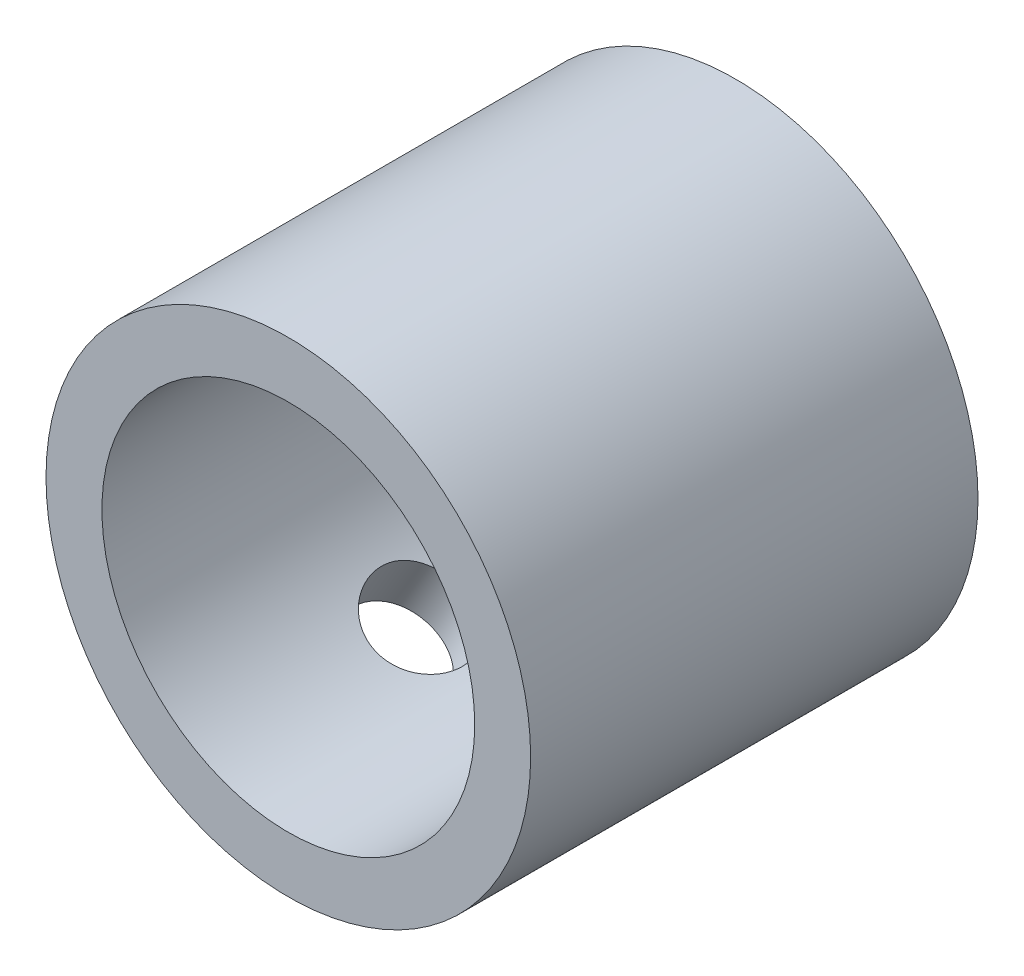
ISO-10303-21;
HEADER;
FILE_DESCRIPTION(('STEP AP214'),'2;1');
FILE_NAME('part.step','',(''),(''),'','','');
FILE_SCHEMA(('AUTOMOTIVE_DESIGN { 1 0 10303 214 1 1 1 1 }'));
ENDSEC;
DATA;
#1=APPLICATION_CONTEXT('core data for automotive mechanical design processes');
#2=APPLICATION_PROTOCOL_DEFINITION('international standard','automotive_design',2000,#1);
#3=PRODUCT_CONTEXT('',#1,'mechanical');
#4=PRODUCT('Part','Part','',(#3));
#5=PRODUCT_RELATED_PRODUCT_CATEGORY('part','',(#4));
#6=PRODUCT_DEFINITION_FORMATION('','',#4);
#7=PRODUCT_DEFINITION_CONTEXT('part definition',#1,'design');
#8=PRODUCT_DEFINITION('design','',#6,#7);
#9=PRODUCT_DEFINITION_SHAPE('','',#8);
#10=(LENGTH_UNIT() NAMED_UNIT(*) SI_UNIT(.MILLI.,.METRE.));
#11=(NAMED_UNIT(*) PLANE_ANGLE_UNIT() SI_UNIT($,.RADIAN.));
#12=(NAMED_UNIT(*) SI_UNIT($,.STERADIAN.) SOLID_ANGLE_UNIT());
#13=UNCERTAINTY_MEASURE_WITH_UNIT(LENGTH_MEASURE(1.E-05),#10,'distance_accuracy_value','');
#14=(GEOMETRIC_REPRESENTATION_CONTEXT(3) GLOBAL_UNCERTAINTY_ASSIGNED_CONTEXT((#13)) GLOBAL_UNIT_ASSIGNED_CONTEXT((#10,
#11,#12)) REPRESENTATION_CONTEXT('',''));
#15=CARTESIAN_POINT('',(0.,0.,0.));
#16=DIRECTION('',(0.,0.,1.));
#17=DIRECTION('',(1.,0.,0.));
#18=AXIS2_PLACEMENT_3D('',#15,#16,#17);
#19=CARTESIAN_POINT('',(0.,0.,12.));
#20=DIRECTION('',(0.,0.,1.));
#21=DIRECTION('',(1.,0.,0.));
#22=AXIS2_PLACEMENT_3D('',#19,#20,#21);
#23=PLANE('',#22);
#24=CARTESIAN_POINT('',(0.,0.,12.));
#25=DIRECTION('',(0.,0.,1.));
#26=DIRECTION('',(1.,0.,0.));
#27=AXIS2_PLACEMENT_3D('',#24,#25,#26);
#28=CIRCLE('',#27,6.5);
#29=CARTESIAN_POINT('',(6.5,0.,12.));
#30=VERTEX_POINT('',#29);
#31=EDGE_CURVE('E12',#30,#30,#28,.T.);
#32=ORIENTED_EDGE('',*,*,#31,.T.);
#33=EDGE_LOOP('',(#32));
#34=FACE_BOUND('',#33,.T.);
#35=CARTESIAN_POINT('',(0.,0.,12.));
#36=DIRECTION('',(0.,0.,1.));
#37=DIRECTION('',(1.,0.,0.));
#38=AXIS2_PLACEMENT_3D('',#35,#36,#37);
#39=CIRCLE('',#38,5.);
#40=CARTESIAN_POINT('',(5.,0.,12.));
#41=VERTEX_POINT('',#40);
#42=EDGE_CURVE('E63',#41,#41,#39,.T.);
#43=ORIENTED_EDGE('',*,*,#42,.F.);
#44=EDGE_LOOP('',(#43));
#45=FACE_BOUND('',#44,.T.);
#46=ADVANCED_FACE('F44',(#34,#45),#23,.T.);
#47=CARTESIAN_POINT('',(0.,0.,0.));
#48=DIRECTION('',(0.,0.,1.));
#49=DIRECTION('',(1.,0.,0.));
#50=AXIS2_PLACEMENT_3D('',#47,#48,#49);
#51=PLANE('',#50);
#52=CARTESIAN_POINT('',(0.,0.,0.));
#53=DIRECTION('',(0.,0.,1.));
#54=DIRECTION('',(1.,0.,0.));
#55=AXIS2_PLACEMENT_3D('',#52,#53,#54);
#56=CIRCLE('',#55,6.5);
#57=CARTESIAN_POINT('',(6.5,0.,0.));
#58=VERTEX_POINT('',#57);
#59=EDGE_CURVE('E58',#58,#58,#56,.T.);
#60=ORIENTED_EDGE('',*,*,#59,.F.);
#61=EDGE_LOOP('',(#60));
#62=FACE_BOUND('',#61,.T.);
#63=CARTESIAN_POINT('',(0.,0.,0.));
#64=DIRECTION('',(0.,0.,1.));
#65=DIRECTION('',(1.,0.,0.));
#66=AXIS2_PLACEMENT_3D('',#63,#64,#65);
#67=CIRCLE('',#66,5.);
#68=CARTESIAN_POINT('',(5.,0.,0.));
#69=VERTEX_POINT('',#68);
#70=EDGE_CURVE('E65',#69,#69,#67,.T.);
#71=ORIENTED_EDGE('',*,*,#70,.T.);
#72=EDGE_LOOP('',(#71));
#73=FACE_BOUND('',#72,.T.);
#74=ADVANCED_FACE('F86',(#62,#73),#51,.F.);
#75=CARTESIAN_POINT('',(0.,0.,12.));
#76=DIRECTION('',(0.,0.,-1.));
#77=DIRECTION('',(-1.,0.,0.));
#78=AXIS2_PLACEMENT_3D('',#75,#76,#77);
#79=CYLINDRICAL_SURFACE('',#78,6.5);
#80=CARTESIAN_POINT('',(-2.10680595081272,-6.14909494849609,6.));
#81=CARTESIAN_POINT('',(-2.10680891015902,-6.14909481194707,5.93048707012988));
#82=CARTESIAN_POINT('',(-2.11241892745597,-6.14718063383391,5.86094038493951));
#83=CARTESIAN_POINT('',(-2.13464610579889,-6.13949664863014,5.72381047058596));
#84=CARTESIAN_POINT('',(-2.1512724040642,-6.13372364088048,5.65622891997642));
#85=CARTESIAN_POINT('',(-2.19485925341188,-6.11826148900385,5.52503317761874));
#86=CARTESIAN_POINT('',(-2.22180993201846,-6.10857608554421,5.46141526308505));
#87=CARTESIAN_POINT('',(-2.28504088258076,-6.08520494153356,5.33981372503317));
#88=CARTESIAN_POINT('',(-2.32132050504985,-6.07151947945995,5.28182970966664));
#89=CARTESIAN_POINT('',(-2.40242260829211,-6.03989047703804,5.17237939378113));
#90=CARTESIAN_POINT('',(-2.44734030595061,-6.02189887195448,5.12099752524567));
#91=CARTESIAN_POINT('',(-2.5439279708677,-5.98173561891913,5.0269462349264));
#92=CARTESIAN_POINT('',(-2.59559839219956,-5.95956368982547,4.98427739952779));
#93=CARTESIAN_POINT('',(-2.70445910262546,-5.91096244381565,4.90853829487111));
#94=CARTESIAN_POINT('',(-2.76169039235706,-5.88450036320741,4.87554787064747));
#95=CARTESIAN_POINT('',(-2.87947386880325,-5.82776951844491,4.82061678733642));
#96=CARTESIAN_POINT('',(-2.94002576775632,-5.79750108385343,4.79867517244008));
#97=CARTESIAN_POINT('',(-3.06178111774662,-5.73412130276562,4.76672629824719));
#98=CARTESIAN_POINT('',(-3.1229675898993,-5.70104917422161,4.75657661243997));
#99=CARTESIAN_POINT('',(-3.24484859964826,-5.63256970840047,4.74805570838893));
#100=CARTESIAN_POINT('',(-3.30554318073036,-5.5971625801353,4.749683437332));
#101=CARTESIAN_POINT('',(-3.4238942369635,-5.5255471978732,4.76456238130295));
#102=CARTESIAN_POINT('',(-3.48158019855085,-5.48935563842616,4.77766021656545));
#103=CARTESIAN_POINT('',(-3.5932467434158,-5.41691887407388,4.81486472715625));
#104=CARTESIAN_POINT('',(-3.64722718646145,-5.38067366719137,4.83897181885584));
#105=CARTESIAN_POINT('',(-3.75049370546047,-5.30921528408094,4.89765514107205));
#106=CARTESIAN_POINT('',(-3.79975024625686,-5.27400944739583,4.93229222264249));
#107=CARTESIAN_POINT('',(-3.8921354899625,-5.20620495037745,5.01100739696977));
#108=CARTESIAN_POINT('',(-3.93526353783645,-5.17360656890086,5.05508649766285));
#109=CARTESIAN_POINT('',(-4.01516583574229,-5.11185275887995,5.15227825458429));
#110=CARTESIAN_POINT('',(-4.05182641531518,-5.08276132491211,5.2055251171175));
#111=CARTESIAN_POINT('',(-4.11720290964005,-5.02995146103541,5.31909508733619));
#112=CARTESIAN_POINT('',(-4.14591869586581,-5.00623311805041,5.37941830947643));
#113=CARTESIAN_POINT('',(-4.19488630910864,-4.96527488683251,5.50560700863562));
#114=CARTESIAN_POINT('',(-4.21512230669786,-4.94804712071205,5.57148257756181));
#115=CARTESIAN_POINT('',(-4.24663596941345,-4.92102815953233,5.70680377718947));
#116=CARTESIAN_POINT('',(-4.25791470671825,-4.91123607443285,5.77624897954819));
#117=CARTESIAN_POINT('',(-4.27117111968917,-4.89971163491314,5.91555966231427));
#118=CARTESIAN_POINT('',(-4.27329330958192,-4.89785405798343,5.9854010568419));
#119=CARTESIAN_POINT('',(-4.26858766204806,-4.90195560759049,6.12454768193484));
#120=CARTESIAN_POINT('',(-4.26176029158196,-4.90791432629701,6.1938529402843));
#121=CARTESIAN_POINT('',(-4.23939864468693,-4.92724184014794,6.32933747159623));
#122=CARTESIAN_POINT('',(-4.22394112871789,-4.94054529637308,6.39553880208332));
#123=CARTESIAN_POINT('',(-4.18468162103085,-4.97384139458384,6.52364442372726));
#124=CARTESIAN_POINT('',(-4.16087898668303,-4.99383455171569,6.58554838351792));
#125=CARTESIAN_POINT('',(-4.10504584434213,-5.03983311068238,6.7041271211925));
#126=CARTESIAN_POINT('',(-4.07291920101646,-5.06590837900064,6.76072950721886));
#127=CARTESIAN_POINT('',(-4.00119537075471,-5.12274579527424,6.86634255943298));
#128=CARTESIAN_POINT('',(-3.96159747556264,-5.15350838752292,6.91535250507359));
#129=CARTESIAN_POINT('',(-3.87509751578268,-5.2188689690894,7.00509487601673));
#130=CARTESIAN_POINT('',(-3.82810028452954,-5.25351494573741,7.04570076602868));
#131=CARTESIAN_POINT('',(-3.72823360544658,-5.32485062485311,7.11658765304746));
#132=CARTESIAN_POINT('',(-3.6753643918481,-5.36154024577144,7.14686906169832));
#133=CARTESIAN_POINT('',(-3.56531377942996,-5.43533799719761,7.19605986491778));
#134=CARTESIAN_POINT('',(-3.50815748238342,-5.47244275202841,7.21503040532308));
#135=CARTESIAN_POINT('',(-3.39078048452915,-5.54593530147536,7.2412555973101));
#136=CARTESIAN_POINT('',(-3.33056012446323,-5.58232317519131,7.24851154869841));
#137=CARTESIAN_POINT('',(-3.20975208152319,-5.65263643701629,7.25105441574626));
#138=CARTESIAN_POINT('',(-3.1491859142281,-5.68659203454368,7.24653211116508));
#139=CARTESIAN_POINT('',(-3.02851510166027,-5.75176493481433,7.22606595991717));
#140=CARTESIAN_POINT('',(-2.96841045146539,-5.78298226679866,7.21012223523286));
#141=CARTESIAN_POINT('',(-2.85058893998532,-5.84195842480286,7.16734790380587));
#142=CARTESIAN_POINT('',(-2.79286764934579,-5.86972387886127,7.14053859582399));
#143=CARTESIAN_POINT('',(-2.68144099807801,-5.92145692862773,7.07681744274669));
#144=CARTESIAN_POINT('',(-2.62773592537912,-5.94542425217906,7.03990487421402));
#145=CARTESIAN_POINT('',(-2.52523693013143,-5.98968662181435,6.95637327483416));
#146=CARTESIAN_POINT('',(-2.47652878762088,-6.00992117146641,6.90961691395763));
#147=CARTESIAN_POINT('',(-2.38654501679295,-6.04621888975443,6.80800890872296));
#148=CARTESIAN_POINT('',(-2.34527114323821,-6.06228107395227,6.75315535867328));
#149=CARTESIAN_POINT('',(-2.27122546552764,-6.09041242597172,6.63626508051112));
#150=CARTESIAN_POINT('',(-2.23854110552881,-6.10244084562665,6.57416312049585));
#151=CARTESIAN_POINT('',(-2.18346045666596,-6.12236599158883,6.44497961307763));
#152=CARTESIAN_POINT('',(-2.16105459923223,-6.1302665615925,6.37790276481723));
#153=CARTESIAN_POINT('',(-2.13183892964887,-6.14047470191173,6.25887081263462));
#154=CARTESIAN_POINT('',(-2.12247198250864,-6.14370870613863,6.20760600620068));
#155=CARTESIAN_POINT('',(-2.10995447621785,-6.14801884844823,6.10423377682843));
#156=CARTESIAN_POINT('',(-2.10680373165714,-6.14909505089151,6.05212637906875));
#157=CARTESIAN_POINT('',(-2.10680595081272,-6.14909494849609,6.));
#158=B_SPLINE_CURVE_WITH_KNOTS('',3,(#80,#81,#82,#83,#84,#85,#86,#87,#88,#89,#90,#91,#92,#93,
#94,#95,#96,#97,#98,#99,#100,#101,#102,#103,#104,#105,#106,#107,#108,#109,#110,#111,#112,#113,
#114,#115,#116,#117,#118,#119,#120,#121,#122,#123,#124,#125,#126,#127,#128,#129,#130,#131,#132,
#133,#134,#135,#136,#137,#138,#139,#140,#141,#142,#143,#144,#145,#146,#147,#148,#149,#150,#151,
#152,#153,#154,#155,#156,#157),.UNSPECIFIED.,.T.,.F.,(4,2,2,2,2,2,2,2,2,2,2,2,2,2,2,2,2,2,2,2,2,
2,2,2,2,2,2,2,2,2,2,2,2,2,2,2,2,2,4),(0.,0.208347994425064,0.416869015339832,0.625191138043343,
0.833498761161481,1.04424985912792,1.25501513592546,1.46747321088402,1.67991290338878,
1.88975909537704,2.09958652891118,2.30665024511141,2.513721793133,2.72201348359887,
2.93032742030891,3.14200045966175,3.35367692313738,3.56574678669524,3.77779126179576,
3.98647658946277,4.19515102900508,4.40199833043661,4.60886156399134,4.81822954602391,
5.02761738559911,5.23995929713473,5.45229274146445,5.663467664851,5.87461915545403,
6.08237184297277,6.29012231169612,6.49746750164924,6.70482754230236,6.9152989101117,
7.12581989203801,7.33840759539416,7.55079699078513,7.70703771468345,7.86327377833244),.UNSPECIFIED.);
#159=CARTESIAN_POINT('',(-2.10680595081272,-6.14909494849609,6.));
#160=VERTEX_POINT('',#159);
#161=EDGE_CURVE('E68',#160,#160,#158,.T.);
#162=ORIENTED_EDGE('',*,*,#161,.T.);
#163=EDGE_LOOP('',(#162));
#164=FACE_BOUND('',#163,.T.);
#165=ORIENTED_EDGE('',*,*,#31,.F.);
#166=EDGE_LOOP('',(#165));
#167=FACE_BOUND('',#166,.T.);
#168=ORIENTED_EDGE('',*,*,#59,.T.);
#169=EDGE_LOOP('',(#168));
#170=FACE_BOUND('',#169,.T.);
#171=ADVANCED_FACE('F46',(#164,#167,#170),#79,.T.);
#172=CARTESIAN_POINT('',(0.,0.,12.));
#173=DIRECTION('',(0.,0.,-1.));
#174=DIRECTION('',(-1.,0.,0.));
#175=AXIS2_PLACEMENT_3D('',#172,#173,#174);
#176=CYLINDRICAL_SURFACE('',#175,5.);
#177=CARTESIAN_POINT('',(-1.33808283664909,-4.81762745781211,6.));
#178=CARTESIAN_POINT('',(-1.3380851935023,-4.81762761859338,5.9309746245377));
#179=CARTESIAN_POINT('',(-1.3437972917423,-4.81605142986842,5.861927550661));
#180=CARTESIAN_POINT('',(-1.36639461064072,-4.80968801428216,5.72581621091298));
#181=CARTESIAN_POINT('',(-1.38328633397268,-4.80489891859856,5.65875312276584));
#182=CARTESIAN_POINT('',(-1.42747766012207,-4.7919550336329,5.52859823090648));
#183=CARTESIAN_POINT('',(-1.45476382646836,-4.78380458831098,5.46550142230717));
#184=CARTESIAN_POINT('',(-1.51865372615025,-4.76390655405743,5.34484457373004));
#185=CARTESIAN_POINT('',(-1.55525785506509,-4.75215881240402,5.28728476895989));
#186=CARTESIAN_POINT('',(-1.63726705169211,-4.72453814640111,5.1780691773689));
#187=CARTESIAN_POINT('',(-1.68283233655892,-4.70858799524394,5.12655319982498));
#188=CARTESIAN_POINT('',(-1.78070418211526,-4.67245218077467,5.03211930281983));
#189=CARTESIAN_POINT('',(-1.83301137229471,-4.65226612184629,4.98920218718913));
#190=CARTESIAN_POINT('',(-1.9434194018417,-4.60724634548388,4.91261226618436));
#191=CARTESIAN_POINT('',(-2.00159089811712,-4.58235170770138,4.87907680591927));
#192=CARTESIAN_POINT('',(-2.1211702202573,-4.52823777728047,4.82309517792346));
#193=CARTESIAN_POINT('',(-2.1825775671427,-4.49901912354316,4.80064737404225));
#194=CARTESIAN_POINT('',(-2.30534891038284,-4.43734020071079,4.76792608271071));
#195=CARTESIAN_POINT('',(-2.36668858366203,-4.40495759214483,4.75741517783671));
#196=CARTESIAN_POINT('',(-2.48861676575069,-4.33723949811071,4.74812081036223));
#197=CARTESIAN_POINT('',(-2.5492053842911,-4.30190444998227,4.7493356138952));
#198=CARTESIAN_POINT('',(-2.66651897811669,-4.23016573151379,4.76328742512508));
#199=CARTESIAN_POINT('',(-2.72329985347999,-4.19380317146955,4.77576816252693));
#200=CARTESIAN_POINT('',(-2.83297473221474,-4.12051055422056,4.81148563502425));
#201=CARTESIAN_POINT('',(-2.88586852850447,-4.08358046690768,4.83472294268871));
#202=CARTESIAN_POINT('',(-2.98703630965741,-4.01018189362516,4.89150128534354));
#203=CARTESIAN_POINT('',(-3.03526423408174,-3.97372059340996,4.92513352233088));
#204=CARTESIAN_POINT('',(-3.12562230931727,-3.90304758915705,5.00167783955813));
#205=CARTESIAN_POINT('',(-3.16775139712276,-3.86883627785016,5.04459153428031));
#206=CARTESIAN_POINT('',(-3.24624778767165,-3.80323101449297,5.13985437099119));
#207=CARTESIAN_POINT('',(-3.28242829014057,-3.77193837303691,5.19242744617389));
#208=CARTESIAN_POINT('',(-3.3470109867121,-3.71475214256906,5.30479998677013));
#209=CARTESIAN_POINT('',(-3.37541281726892,-3.68885880591393,5.3645997897455));
#210=CARTESIAN_POINT('',(-3.42408844059663,-3.64372482616616,5.49014501707448));
#211=CARTESIAN_POINT('',(-3.44432215353372,-3.62451705012923,5.5559178651566));
#212=CARTESIAN_POINT('',(-3.47609460854906,-3.59405842233237,5.69129273403823));
#213=CARTESIAN_POINT('',(-3.48763521130512,-3.58280586786441,5.76089393199157));
#214=CARTESIAN_POINT('',(-3.50161432539894,-3.56914428143681,5.89997975076156));
#215=CARTESIAN_POINT('',(-3.50428519192673,-3.56650952270873,5.96941889666482));
#216=CARTESIAN_POINT('',(-3.50112590068178,-3.56961095316065,6.10791096828908));
#217=CARTESIAN_POINT('',(-3.49529652545884,-3.57534637176488,6.17696392897562));
#218=CARTESIAN_POINT('',(-3.47541623191329,-3.59467202718574,6.31155713247735));
#219=CARTESIAN_POINT('',(-3.46150139119302,-3.60813221173491,6.37713636328542));
#220=CARTESIAN_POINT('',(-3.42580153292666,-3.64204423000571,6.50421572892584));
#221=CARTESIAN_POINT('',(-3.40401558308151,-3.66249689194083,6.56571537952767));
#222=CARTESIAN_POINT('',(-3.35241867490472,-3.70978880524115,6.68422063893367));
#223=CARTESIAN_POINT('',(-3.32245867235205,-3.73674547272597,6.74111442002155));
#224=CARTESIAN_POINT('',(-3.25518387993184,-3.79549313568499,6.84759418140067));
#225=CARTESIAN_POINT('',(-3.21786788131916,-3.82728492547522,6.89717895832503));
#226=CARTESIAN_POINT('',(-3.13545240879217,-3.89510607428045,6.98890552128548));
#227=CARTESIAN_POINT('',(-3.09018154480862,-3.93122155889123,7.0308300312744));
#228=CARTESIAN_POINT('',(-2.99337617434291,-4.00542291339138,7.10446793347562));
#229=CARTESIAN_POINT('',(-2.94184199476819,-4.04350868038431,7.1361818583041));
#230=CARTESIAN_POINT('',(-2.83402706318536,-4.11978335913453,7.18822301726396));
#231=CARTESIAN_POINT('',(-2.77778393808173,-4.15796946063661,7.20863214218953));
#232=CARTESIAN_POINT('',(-2.6616546360526,-4.23324666104733,7.23773016730421));
#233=CARTESIAN_POINT('',(-2.60176916452918,-4.27033796992747,7.24642132936952));
#234=CARTESIAN_POINT('',(-2.48172009894739,-4.34117411765006,7.25170948696941));
#235=CARTESIAN_POINT('',(-2.42160780590851,-4.37498232325402,7.24862713636923));
#236=CARTESIAN_POINT('',(-2.30132577871396,-4.43943191453744,7.23119021588208));
#237=CARTESIAN_POINT('',(-2.24115604631975,-4.47007339436822,7.21683598123362));
#238=CARTESIAN_POINT('',(-2.12291300721218,-4.52742077765236,7.17743472528634));
#239=CARTESIAN_POINT('',(-2.06483015840338,-4.55414697980769,7.15244568335672));
#240=CARTESIAN_POINT('',(-1.95217732036198,-4.60356293685429,7.09253677622584));
#241=CARTESIAN_POINT('',(-1.8976077750182,-4.62625218233187,7.05761565916304));
#242=CARTESIAN_POINT('',(-1.79240286351974,-4.66803764830788,6.97785595750366));
#243=CARTESIAN_POINT('',(-1.74189306907383,-4.68703476773941,6.93279982136578));
#244=CARTESIAN_POINT('',(-1.64795708858034,-4.72088295679257,6.83447143503275));
#245=CARTESIAN_POINT('',(-1.60453270153452,-4.73573297413401,6.78119710487762));
#246=CARTESIAN_POINT('',(-1.52556741000994,-4.76176533070655,6.66674823224833));
#247=CARTESIAN_POINT('',(-1.49018869286087,-4.77287407751605,6.60544484573421));
#248=CARTESIAN_POINT('',(-1.42980445404578,-4.79131120083473,6.47743063759662));
#249=CARTESIAN_POINT('',(-1.40479138575312,-4.79864232855879,6.41072379236657));
#250=CARTESIAN_POINT('',(-1.36985609992673,-4.80871668554483,6.2867787352166));
#251=CARTESIAN_POINT('',(-1.35797529014593,-4.81206512444428,6.23013354452017));
#252=CARTESIAN_POINT('',(-1.34208800689615,-4.81652034760615,6.11566391375005));
#253=CARTESIAN_POINT('',(-1.3380808617321,-4.81762732308599,6.05783957469367));
#254=CARTESIAN_POINT('',(-1.33808283664909,-4.81762745781211,6.));
#255=B_SPLINE_CURVE_WITH_KNOTS('',3,(#177,#178,#179,#180,#181,#182,#183,#184,#185,#186,#187,
#188,#189,#190,#191,#192,#193,#194,#195,#196,#197,#198,#199,#200,#201,#202,#203,#204,#205,#206,
#207,#208,#209,#210,#211,#212,#213,#214,#215,#216,#217,#218,#219,#220,#221,#222,#223,#224,#225,
#226,#227,#228,#229,#230,#231,#232,#233,#234,#235,#236,#237,#238,#239,#240,#241,#242,#243,#244,
#245,#246,#247,#248,#249,#250,#251,#252,#253,#254),.UNSPECIFIED.,.T.,.F.,(4,2,2,2,2,2,2,2,2,2,2,
2,2,2,2,2,2,2,2,2,2,2,2,2,2,2,2,2,2,2,2,2,2,2,2,2,2,2,4),(0.,0.206863720868068,
0.413847870714332,0.62056536358301,0.827291633777391,1.03811977096488,1.24896760739933,
1.4627574819896,1.67651579923546,1.88594375497673,2.0953407433301,2.30009131344473,
2.50485278362392,2.71146437127222,2.91811192734456,3.13035233285955,3.342602655999,
3.555882160042,3.76911600064773,3.97671787380858,4.184300635919,4.38848702504602,
4.59269760710708,4.80091422929577,5.00916509442521,5.22262665482658,5.43607707859775,
5.64796036403463,5.85980274454518,6.06591723063727,6.27202558688489,6.47702438279854,
6.68204902869035,6.89198548291034,7.10197515782753,7.31588238642337,7.52963360683308,
7.70298913588663,7.87632987549759),.UNSPECIFIED.);
#256=CARTESIAN_POINT('',(-1.33808283664909,-4.81762745781211,6.));
#257=VERTEX_POINT('',#256);
#258=EDGE_CURVE('E49',#257,#257,#255,.T.);
#259=ORIENTED_EDGE('',*,*,#258,.F.);
#260=EDGE_LOOP('',(#259));
#261=FACE_BOUND('',#260,.T.);
#262=ORIENTED_EDGE('',*,*,#42,.T.);
#263=EDGE_LOOP('',(#262));
#264=FACE_BOUND('',#263,.T.);
#265=ORIENTED_EDGE('',*,*,#70,.F.);
#266=EDGE_LOOP('',(#265));
#267=FACE_BOUND('',#266,.T.);
#268=ADVANCED_FACE('F78',(#261,#264,#267),#176,.F.);
#269=CARTESIAN_POINT('',(-3.78902968523666,-6.56279192621661,6.));
#270=DIRECTION('',(-0.5,-0.866025403784439,0.));
#271=DIRECTION('',(0.866025403784439,-0.5,0.));
#272=AXIS2_PLACEMENT_3D('',#269,#270,#271);
#273=CYLINDRICAL_SURFACE('',#272,1.25);
#274=ORIENTED_EDGE('',*,*,#258,.T.);
#275=EDGE_LOOP('',(#274));
#276=FACE_BOUND('',#275,.T.);
#277=ORIENTED_EDGE('',*,*,#161,.F.);
#278=EDGE_LOOP('',(#277));
#279=FACE_BOUND('',#278,.T.);
#280=ADVANCED_FACE('F75',(#276,#279),#273,.F.);
#281=CLOSED_SHELL('',(#46,#74,#171,#268,#280));
#282=MANIFOLD_SOLID_BREP('B2',#281);
#283=ADVANCED_BREP_SHAPE_REPRESENTATION('',(#18,#282),#14);
#284=SHAPE_DEFINITION_REPRESENTATION(#9,#283);
ENDSEC;
END-ISO-10303-21;
